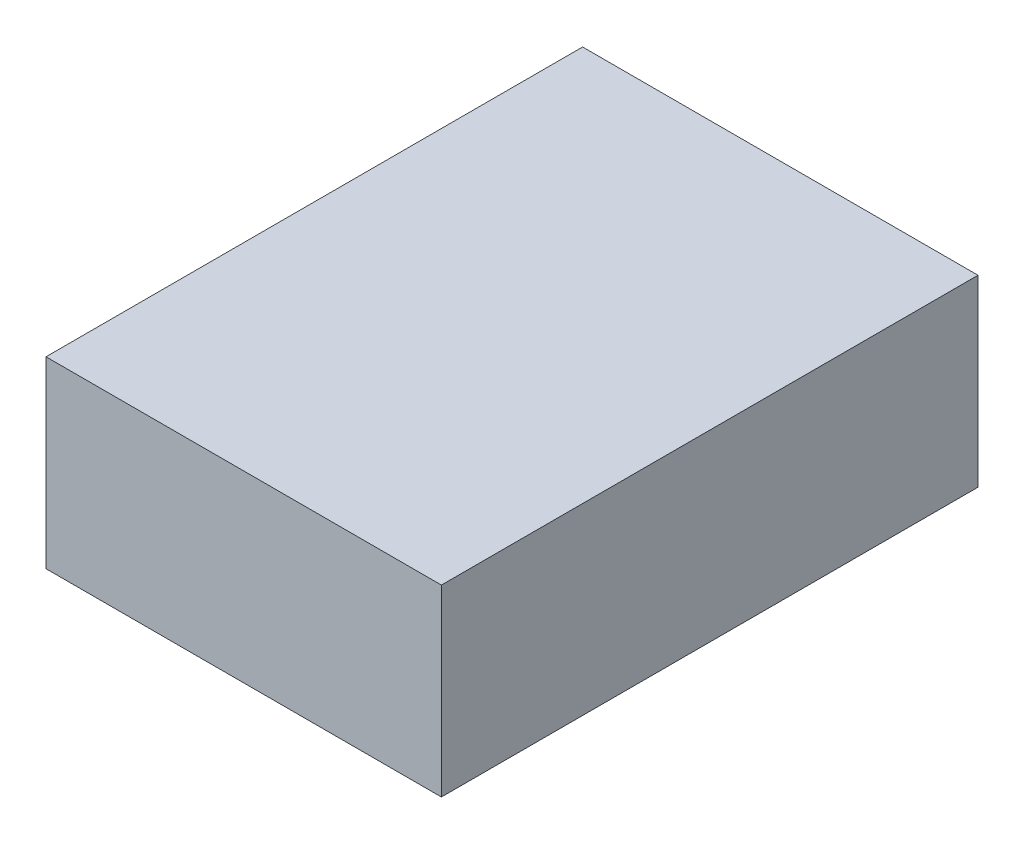
ISO-10303-21;
HEADER;
FILE_DESCRIPTION(('STEP AP214'),'2;1');
FILE_NAME('part.step','',(''),(''),'','','');
FILE_SCHEMA(('AUTOMOTIVE_DESIGN { 1 0 10303 214 1 1 1 1 }'));
ENDSEC;
DATA;
#1=APPLICATION_CONTEXT('core data for automotive mechanical design processes');
#2=APPLICATION_PROTOCOL_DEFINITION('international standard','automotive_design',2000,#1);
#3=PRODUCT_CONTEXT('',#1,'mechanical');
#4=PRODUCT('Part','Part','',(#3));
#5=PRODUCT_RELATED_PRODUCT_CATEGORY('part','',(#4));
#6=PRODUCT_DEFINITION_FORMATION('','',#4);
#7=PRODUCT_DEFINITION_CONTEXT('part definition',#1,'design');
#8=PRODUCT_DEFINITION('design','',#6,#7);
#9=PRODUCT_DEFINITION_SHAPE('','',#8);
#10=(LENGTH_UNIT() NAMED_UNIT(*) SI_UNIT(.MILLI.,.METRE.));
#11=(NAMED_UNIT(*) PLANE_ANGLE_UNIT() SI_UNIT($,.RADIAN.));
#12=(NAMED_UNIT(*) SI_UNIT($,.STERADIAN.) SOLID_ANGLE_UNIT());
#13=UNCERTAINTY_MEASURE_WITH_UNIT(LENGTH_MEASURE(1.E-05),#10,'distance_accuracy_value','');
#14=(GEOMETRIC_REPRESENTATION_CONTEXT(3) GLOBAL_UNCERTAINTY_ASSIGNED_CONTEXT((#13)) GLOBAL_UNIT_ASSIGNED_CONTEXT((#10,
#11,#12)) REPRESENTATION_CONTEXT('',''));
#15=CARTESIAN_POINT('',(0.,0.,0.));
#16=DIRECTION('',(0.,0.,1.));
#17=DIRECTION('',(1.,0.,0.));
#18=AXIS2_PLACEMENT_3D('',#15,#16,#17);
#19=CARTESIAN_POINT('',(88.9,82.55,120.65));
#20=DIRECTION('',(-1.,0.,0.));
#21=DIRECTION('',(0.,0.,1.));
#22=AXIS2_PLACEMENT_3D('',#19,#20,#21);
#23=PLANE('',#22);
#24=DIRECTION('',(0.,0.,-1.));
#25=VECTOR('',#24,1.);
#26=CARTESIAN_POINT('',(88.9,0.,120.65));
#27=LINE('',#26,#25);
#28=CARTESIAN_POINT('',(88.9,0.,120.65));
#29=VERTEX_POINT('',#28);
#30=CARTESIAN_POINT('',(88.9,0.,-120.65));
#31=VERTEX_POINT('',#30);
#32=EDGE_CURVE('E109',#29,#31,#27,.T.);
#33=ORIENTED_EDGE('',*,*,#32,.T.);
#34=DIRECTION('',(0.,-1.,0.));
#35=VECTOR('',#34,1.);
#36=CARTESIAN_POINT('',(88.9,82.55,-120.65));
#37=LINE('',#36,#35);
#38=CARTESIAN_POINT('',(88.9,82.55,-120.65));
#39=VERTEX_POINT('',#38);
#40=EDGE_CURVE('E11',#39,#31,#37,.T.);
#41=ORIENTED_EDGE('',*,*,#40,.F.);
#42=DIRECTION('',(0.,0.,-1.));
#43=VECTOR('',#42,1.);
#44=CARTESIAN_POINT('',(88.9,82.55,120.65));
#45=LINE('',#44,#43);
#46=CARTESIAN_POINT('',(88.9,82.55,120.65));
#47=VERTEX_POINT('',#46);
#48=EDGE_CURVE('E93',#47,#39,#45,.T.);
#49=ORIENTED_EDGE('',*,*,#48,.F.);
#50=DIRECTION('',(0.,-1.,0.));
#51=VECTOR('',#50,1.);
#52=CARTESIAN_POINT('',(88.9,82.55,120.65));
#53=LINE('',#52,#51);
#54=EDGE_CURVE('E105',#47,#29,#53,.T.);
#55=ORIENTED_EDGE('',*,*,#54,.T.);
#56=EDGE_LOOP('',(#33,#41,#49,#55));
#57=FACE_BOUND('',#56,.T.);
#58=ADVANCED_FACE('F41',(#57),#23,.F.);
#59=CARTESIAN_POINT('',(-88.9,82.55,-120.65));
#60=DIRECTION('',(0.,0.,1.));
#61=DIRECTION('',(1.,0.,0.));
#62=AXIS2_PLACEMENT_3D('',#59,#60,#61);
#63=PLANE('',#62);
#64=DIRECTION('',(-1.,0.,0.));
#65=VECTOR('',#64,1.);
#66=CARTESIAN_POINT('',(-88.9,0.,-120.65));
#67=LINE('',#66,#65);
#68=CARTESIAN_POINT('',(-88.9,0.,-120.65));
#69=VERTEX_POINT('',#68);
#70=EDGE_CURVE('E98',#31,#69,#67,.T.);
#71=ORIENTED_EDGE('',*,*,#70,.T.);
#72=DIRECTION('',(0.,-1.,0.));
#73=VECTOR('',#72,1.);
#74=CARTESIAN_POINT('',(-88.9,82.55,-120.65));
#75=LINE('',#74,#73);
#76=CARTESIAN_POINT('',(-88.9,82.55,-120.65));
#77=VERTEX_POINT('',#76);
#78=EDGE_CURVE('E50',#77,#69,#75,.T.);
#79=ORIENTED_EDGE('',*,*,#78,.F.);
#80=DIRECTION('',(-1.,0.,0.));
#81=VECTOR('',#80,1.);
#82=CARTESIAN_POINT('',(-88.9,82.55,-120.65));
#83=LINE('',#82,#81);
#84=EDGE_CURVE('E88',#39,#77,#83,.T.);
#85=ORIENTED_EDGE('',*,*,#84,.F.);
#86=ORIENTED_EDGE('',*,*,#40,.T.);
#87=EDGE_LOOP('',(#71,#79,#85,#86));
#88=FACE_BOUND('',#87,.T.);
#89=ADVANCED_FACE('F97',(#88),#63,.F.);
#90=CARTESIAN_POINT('',(-88.9,82.55,120.65));
#91=DIRECTION('',(1.,0.,0.));
#92=DIRECTION('',(0.,0.,-1.));
#93=AXIS2_PLACEMENT_3D('',#90,#91,#92);
#94=PLANE('',#93);
#95=DIRECTION('',(0.,0.,1.));
#96=VECTOR('',#95,1.);
#97=CARTESIAN_POINT('',(-88.9,0.,120.65));
#98=LINE('',#97,#96);
#99=CARTESIAN_POINT('',(-88.9,0.,120.65));
#100=VERTEX_POINT('',#99);
#101=EDGE_CURVE('E75',#69,#100,#98,.T.);
#102=ORIENTED_EDGE('',*,*,#101,.T.);
#103=DIRECTION('',(0.,-1.,0.));
#104=VECTOR('',#103,1.);
#105=CARTESIAN_POINT('',(-88.9,82.55,120.65));
#106=LINE('',#105,#104);
#107=CARTESIAN_POINT('',(-88.9,82.55,120.65));
#108=VERTEX_POINT('',#107);
#109=EDGE_CURVE('E100',#108,#100,#106,.T.);
#110=ORIENTED_EDGE('',*,*,#109,.F.);
#111=DIRECTION('',(0.,0.,1.));
#112=VECTOR('',#111,1.);
#113=CARTESIAN_POINT('',(-88.9,82.55,120.65));
#114=LINE('',#113,#112);
#115=EDGE_CURVE('E91',#77,#108,#114,.T.);
#116=ORIENTED_EDGE('',*,*,#115,.F.);
#117=ORIENTED_EDGE('',*,*,#78,.T.);
#118=EDGE_LOOP('',(#102,#110,#116,#117));
#119=FACE_BOUND('',#118,.T.);
#120=ADVANCED_FACE('F101',(#119),#94,.F.);
#121=CARTESIAN_POINT('',(-88.9,82.55,120.65));
#122=DIRECTION('',(0.,0.,-1.));
#123=DIRECTION('',(-1.,0.,0.));
#124=AXIS2_PLACEMENT_3D('',#121,#122,#123);
#125=PLANE('',#124);
#126=DIRECTION('',(1.,0.,0.));
#127=VECTOR('',#126,1.);
#128=CARTESIAN_POINT('',(-88.9,0.,120.65));
#129=LINE('',#128,#127);
#130=EDGE_CURVE('E81',#100,#29,#129,.T.);
#131=ORIENTED_EDGE('',*,*,#130,.T.);
#132=ORIENTED_EDGE('',*,*,#54,.F.);
#133=DIRECTION('',(1.,0.,0.));
#134=VECTOR('',#133,1.);
#135=CARTESIAN_POINT('',(-88.9,82.55,120.65));
#136=LINE('',#135,#134);
#137=EDGE_CURVE('E58',#108,#47,#136,.T.);
#138=ORIENTED_EDGE('',*,*,#137,.F.);
#139=ORIENTED_EDGE('',*,*,#109,.T.);
#140=EDGE_LOOP('',(#131,#132,#138,#139));
#141=FACE_BOUND('',#140,.T.);
#142=ADVANCED_FACE('F122',(#141),#125,.F.);
#143=CARTESIAN_POINT('',(0.,82.55,0.));
#144=DIRECTION('',(0.,-1.,0.));
#145=DIRECTION('',(0.,0.,-1.));
#146=AXIS2_PLACEMENT_3D('',#143,#144,#145);
#147=PLANE('',#146);
#148=ORIENTED_EDGE('',*,*,#48,.T.);
#149=ORIENTED_EDGE('',*,*,#84,.T.);
#150=ORIENTED_EDGE('',*,*,#115,.T.);
#151=ORIENTED_EDGE('',*,*,#137,.T.);
#152=EDGE_LOOP('',(#148,#149,#150,#151));
#153=FACE_BOUND('',#152,.T.);
#154=ADVANCED_FACE('F89',(#153),#147,.F.);
#155=CARTESIAN_POINT('',(0.,0.,0.));
#156=DIRECTION('',(0.,-1.,0.));
#157=DIRECTION('',(0.,0.,-1.));
#158=AXIS2_PLACEMENT_3D('',#155,#156,#157);
#159=PLANE('',#158);
#160=ORIENTED_EDGE('',*,*,#32,.F.);
#161=ORIENTED_EDGE('',*,*,#130,.F.);
#162=ORIENTED_EDGE('',*,*,#101,.F.);
#163=ORIENTED_EDGE('',*,*,#70,.F.);
#164=EDGE_LOOP('',(#160,#161,#162,#163));
#165=FACE_BOUND('',#164,.T.);
#166=ADVANCED_FACE('F125',(#165),#159,.T.);
#167=CLOSED_SHELL('',(#58,#89,#120,#142,#154,#166));
#168=MANIFOLD_SOLID_BREP('B2',#167);
#169=ADVANCED_BREP_SHAPE_REPRESENTATION('',(#18,#168),#14);
#170=SHAPE_DEFINITION_REPRESENTATION(#9,#169);
ENDSEC;
END-ISO-10303-21;
